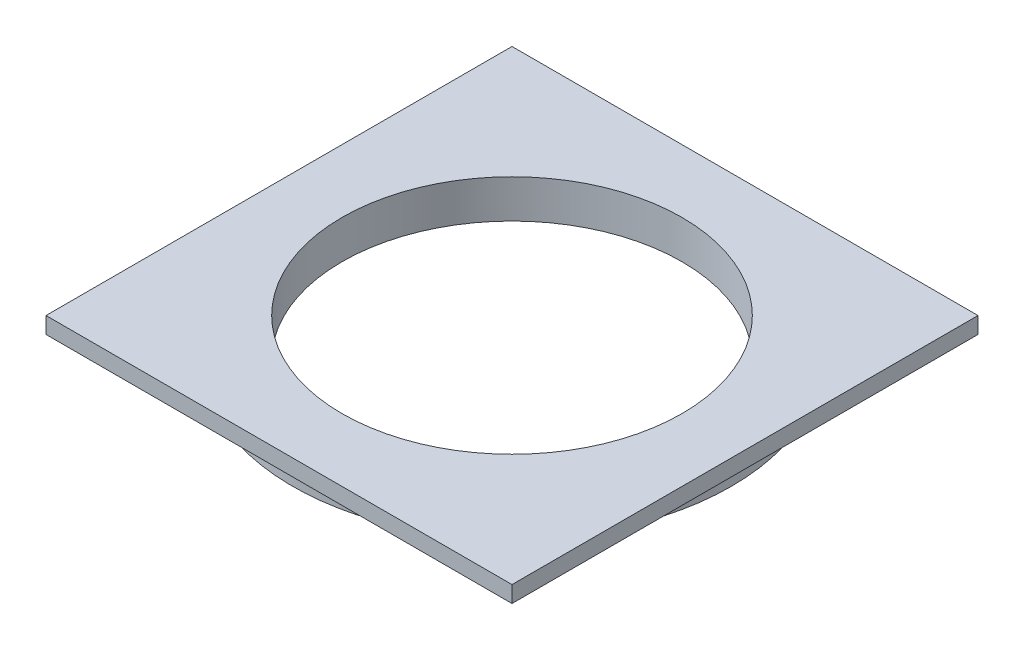
ISO-10303-21;
HEADER;
FILE_DESCRIPTION(('STEP AP214'),'2;1');
FILE_NAME('part.step','',(''),(''),'','','');
FILE_SCHEMA(('AUTOMOTIVE_DESIGN { 1 0 10303 214 1 1 1 1 }'));
ENDSEC;
DATA;
#1=APPLICATION_CONTEXT('core data for automotive mechanical design processes');
#2=APPLICATION_PROTOCOL_DEFINITION('international standard','automotive_design',2000,#1);
#3=PRODUCT_CONTEXT('',#1,'mechanical');
#4=PRODUCT('Part','Part','',(#3));
#5=PRODUCT_RELATED_PRODUCT_CATEGORY('part','',(#4));
#6=PRODUCT_DEFINITION_FORMATION('','',#4);
#7=PRODUCT_DEFINITION_CONTEXT('part definition',#1,'design');
#8=PRODUCT_DEFINITION('design','',#6,#7);
#9=PRODUCT_DEFINITION_SHAPE('','',#8);
#10=(LENGTH_UNIT() NAMED_UNIT(*) SI_UNIT(.MILLI.,.METRE.));
#11=(NAMED_UNIT(*) PLANE_ANGLE_UNIT() SI_UNIT($,.RADIAN.));
#12=(NAMED_UNIT(*) SI_UNIT($,.STERADIAN.) SOLID_ANGLE_UNIT());
#13=UNCERTAINTY_MEASURE_WITH_UNIT(LENGTH_MEASURE(1.E-05),#10,'distance_accuracy_value','');
#14=(GEOMETRIC_REPRESENTATION_CONTEXT(3) GLOBAL_UNCERTAINTY_ASSIGNED_CONTEXT((#13)) GLOBAL_UNIT_ASSIGNED_CONTEXT((#10,
#11,#12)) REPRESENTATION_CONTEXT('',''));
#15=CARTESIAN_POINT('',(0.,0.,0.));
#16=DIRECTION('',(0.,0.,1.));
#17=DIRECTION('',(1.,0.,0.));
#18=AXIS2_PLACEMENT_3D('',#15,#16,#17);
#19=CARTESIAN_POINT('',(-42.5,-3.,42.5));
#20=DIRECTION('',(1.,0.,0.));
#21=DIRECTION('',(0.,0.,-1.));
#22=AXIS2_PLACEMENT_3D('',#19,#20,#21);
#23=PLANE('',#22);
#24=DIRECTION('',(0.,0.,-1.));
#25=VECTOR('',#24,1.);
#26=CARTESIAN_POINT('',(-42.5,0.,42.5));
#27=LINE('',#26,#25);
#28=CARTESIAN_POINT('',(-42.5,0.,42.5));
#29=VERTEX_POINT('',#28);
#30=CARTESIAN_POINT('',(-42.5,0.,-42.5));
#31=VERTEX_POINT('',#30);
#32=EDGE_CURVE('E87',#29,#31,#27,.T.);
#33=ORIENTED_EDGE('',*,*,#32,.T.);
#34=DIRECTION('',(0.,1.,0.));
#35=VECTOR('',#34,1.);
#36=CARTESIAN_POINT('',(-42.5,-3.,-42.5));
#37=LINE('',#36,#35);
#38=CARTESIAN_POINT('',(-42.5,-3.,-42.5));
#39=VERTEX_POINT('',#38);
#40=EDGE_CURVE('E26',#39,#31,#37,.T.);
#41=ORIENTED_EDGE('',*,*,#40,.F.);
#42=DIRECTION('',(0.,0.,-1.));
#43=VECTOR('',#42,1.);
#44=CARTESIAN_POINT('',(-42.5,-3.,42.5));
#45=LINE('',#44,#43);
#46=CARTESIAN_POINT('',(-42.5,-3.,42.5));
#47=VERTEX_POINT('',#46);
#48=EDGE_CURVE('E70',#47,#39,#45,.T.);
#49=ORIENTED_EDGE('',*,*,#48,.F.);
#50=DIRECTION('',(0.,1.,0.));
#51=VECTOR('',#50,1.);
#52=CARTESIAN_POINT('',(-42.5,-3.,42.5));
#53=LINE('',#52,#51);
#54=EDGE_CURVE('E80',#47,#29,#53,.T.);
#55=ORIENTED_EDGE('',*,*,#54,.T.);
#56=EDGE_LOOP('',(#33,#41,#49,#55));
#57=FACE_BOUND('',#56,.T.);
#58=ADVANCED_FACE('F17',(#57),#23,.F.);
#59=CARTESIAN_POINT('',(-42.5,-3.,-42.5));
#60=DIRECTION('',(0.,0.,1.));
#61=DIRECTION('',(1.,0.,0.));
#62=AXIS2_PLACEMENT_3D('',#59,#60,#61);
#63=PLANE('',#62);
#64=DIRECTION('',(1.,0.,0.));
#65=VECTOR('',#64,1.);
#66=CARTESIAN_POINT('',(-42.5,0.,-42.5));
#67=LINE('',#66,#65);
#68=CARTESIAN_POINT('',(42.5,0.,-42.5));
#69=VERTEX_POINT('',#68);
#70=EDGE_CURVE('E75',#31,#69,#67,.T.);
#71=ORIENTED_EDGE('',*,*,#70,.T.);
#72=DIRECTION('',(0.,1.,0.));
#73=VECTOR('',#72,1.);
#74=CARTESIAN_POINT('',(42.5,-3.,-42.5));
#75=LINE('',#74,#73);
#76=CARTESIAN_POINT('',(42.5,-3.,-42.5));
#77=VERTEX_POINT('',#76);
#78=EDGE_CURVE('E73',#77,#69,#75,.T.);
#79=ORIENTED_EDGE('',*,*,#78,.F.);
#80=DIRECTION('',(1.,0.,0.));
#81=VECTOR('',#80,1.);
#82=CARTESIAN_POINT('',(-42.5,-3.,-42.5));
#83=LINE('',#82,#81);
#84=EDGE_CURVE('E65',#39,#77,#83,.T.);
#85=ORIENTED_EDGE('',*,*,#84,.F.);
#86=ORIENTED_EDGE('',*,*,#40,.T.);
#87=EDGE_LOOP('',(#71,#79,#85,#86));
#88=FACE_BOUND('',#87,.T.);
#89=ADVANCED_FACE('F74',(#88),#63,.F.);
#90=CARTESIAN_POINT('',(42.5,-3.,-42.5));
#91=DIRECTION('',(-1.,0.,0.));
#92=DIRECTION('',(0.,0.,1.));
#93=AXIS2_PLACEMENT_3D('',#90,#91,#92);
#94=PLANE('',#93);
#95=DIRECTION('',(0.,0.,1.));
#96=VECTOR('',#95,1.);
#97=CARTESIAN_POINT('',(42.5,0.,-42.5));
#98=LINE('',#97,#96);
#99=CARTESIAN_POINT('',(42.5,0.,42.5));
#100=VERTEX_POINT('',#99);
#101=EDGE_CURVE('E51',#69,#100,#98,.T.);
#102=ORIENTED_EDGE('',*,*,#101,.T.);
#103=DIRECTION('',(0.,1.,0.));
#104=VECTOR('',#103,1.);
#105=CARTESIAN_POINT('',(42.5,-3.,42.5));
#106=LINE('',#105,#104);
#107=CARTESIAN_POINT('',(42.5,-3.,42.5));
#108=VERTEX_POINT('',#107);
#109=EDGE_CURVE('E76',#108,#100,#106,.T.);
#110=ORIENTED_EDGE('',*,*,#109,.F.);
#111=DIRECTION('',(0.,0.,1.));
#112=VECTOR('',#111,1.);
#113=CARTESIAN_POINT('',(42.5,-3.,-42.5));
#114=LINE('',#113,#112);
#115=EDGE_CURVE('E68',#77,#108,#114,.T.);
#116=ORIENTED_EDGE('',*,*,#115,.F.);
#117=ORIENTED_EDGE('',*,*,#78,.T.);
#118=EDGE_LOOP('',(#102,#110,#116,#117));
#119=FACE_BOUND('',#118,.T.);
#120=ADVANCED_FACE('F78',(#119),#94,.F.);
#121=CARTESIAN_POINT('',(42.5,-3.,42.5));
#122=DIRECTION('',(0.,0.,-1.));
#123=DIRECTION('',(-1.,0.,0.));
#124=AXIS2_PLACEMENT_3D('',#121,#122,#123);
#125=PLANE('',#124);
#126=DIRECTION('',(-1.,0.,0.));
#127=VECTOR('',#126,1.);
#128=CARTESIAN_POINT('',(42.5,0.,42.5));
#129=LINE('',#128,#127);
#130=EDGE_CURVE('E57',#100,#29,#129,.T.);
#131=ORIENTED_EDGE('',*,*,#130,.T.);
#132=ORIENTED_EDGE('',*,*,#54,.F.);
#133=DIRECTION('',(-1.,0.,0.));
#134=VECTOR('',#133,1.);
#135=CARTESIAN_POINT('',(42.5,-3.,42.5));
#136=LINE('',#135,#134);
#137=EDGE_CURVE('E34',#108,#47,#136,.T.);
#138=ORIENTED_EDGE('',*,*,#137,.F.);
#139=ORIENTED_EDGE('',*,*,#109,.T.);
#140=EDGE_LOOP('',(#131,#132,#138,#139));
#141=FACE_BOUND('',#140,.T.);
#142=ADVANCED_FACE('F113',(#141),#125,.F.);
#143=CARTESIAN_POINT('',(0.,-3.,0.));
#144=DIRECTION('',(0.,-1.,0.));
#145=DIRECTION('',(0.,0.,-1.));
#146=AXIS2_PLACEMENT_3D('',#143,#144,#145);
#147=PLANE('',#146);
#148=CARTESIAN_POINT('',(0.,-3.,0.));
#149=DIRECTION('',(0.,-1.,0.));
#150=DIRECTION('',(0.,0.,-1.));
#151=AXIS2_PLACEMENT_3D('',#148,#149,#150);
#152=CIRCLE('',#151,40.);
#153=CARTESIAN_POINT('',(0.,-3.,-40.));
#154=VERTEX_POINT('',#153);
#155=EDGE_CURVE('E11',#154,#154,#152,.T.);
#156=ORIENTED_EDGE('',*,*,#155,.F.);
#157=EDGE_LOOP('',(#156));
#158=FACE_BOUND('',#157,.T.);
#159=ORIENTED_EDGE('',*,*,#48,.T.);
#160=ORIENTED_EDGE('',*,*,#84,.T.);
#161=ORIENTED_EDGE('',*,*,#115,.T.);
#162=ORIENTED_EDGE('',*,*,#137,.T.);
#163=EDGE_LOOP('',(#159,#160,#161,#162));
#164=FACE_BOUND('',#163,.T.);
#165=ADVANCED_FACE('F66',(#158,#164),#147,.T.);
#166=CARTESIAN_POINT('',(0.,0.,0.));
#167=DIRECTION('',(0.,-1.,0.));
#168=DIRECTION('',(0.,0.,-1.));
#169=AXIS2_PLACEMENT_3D('',#166,#167,#168);
#170=PLANE('',#169);
#171=CARTESIAN_POINT('',(0.,0.,0.));
#172=DIRECTION('',(0.,-1.,0.));
#173=DIRECTION('',(0.,0.,-1.));
#174=AXIS2_PLACEMENT_3D('',#171,#172,#173);
#175=CIRCLE('',#174,31.);
#176=CARTESIAN_POINT('',(0.,0.,-31.));
#177=VERTEX_POINT('',#176);
#178=EDGE_CURVE('E261',#177,#177,#175,.F.);
#179=ORIENTED_EDGE('',*,*,#178,.F.);
#180=EDGE_LOOP('',(#179));
#181=FACE_BOUND('',#180,.T.);
#182=ORIENTED_EDGE('',*,*,#32,.F.);
#183=ORIENTED_EDGE('',*,*,#130,.F.);
#184=ORIENTED_EDGE('',*,*,#101,.F.);
#185=ORIENTED_EDGE('',*,*,#70,.F.);
#186=EDGE_LOOP('',(#182,#183,#184,#185));
#187=FACE_BOUND('',#186,.T.);
#188=ADVANCED_FACE('F100',(#181,#187),#170,.F.);
#189=CARTESIAN_POINT('',(0.,-7.,0.));
#190=DIRECTION('',(0.,1.,0.));
#191=DIRECTION('',(0.,0.,1.));
#192=AXIS2_PLACEMENT_3D('',#189,#190,#191);
#193=CYLINDRICAL_SURFACE('',#192,40.);
#194=CARTESIAN_POINT('',(0.,-7.,0.));
#195=DIRECTION('',(0.,1.,0.));
#196=DIRECTION('',(1.,0.,0.));
#197=AXIS2_PLACEMENT_3D('',#194,#195,#196);
#198=CIRCLE('',#197,40.);
#199=CARTESIAN_POINT('',(40.,-7.,0.));
#200=VERTEX_POINT('',#199);
#201=EDGE_CURVE('E95',#200,#200,#198,.T.);
#202=ORIENTED_EDGE('',*,*,#201,.T.);
#203=EDGE_LOOP('',(#202));
#204=FACE_BOUND('',#203,.T.);
#205=ORIENTED_EDGE('',*,*,#155,.T.);
#206=EDGE_LOOP('',(#205));
#207=FACE_BOUND('',#206,.T.);
#208=ADVANCED_FACE('F102',(#204,#207),#193,.T.);
#209=CARTESIAN_POINT('',(0.,-7.,0.));
#210=DIRECTION('',(0.,1.,0.));
#211=DIRECTION('',(0.,0.,1.));
#212=AXIS2_PLACEMENT_3D('',#209,#210,#211);
#213=PLANE('',#212);
#214=CARTESIAN_POINT('',(0.,-7.00000000000001,0.));
#215=DIRECTION('',(0.,1.,0.));
#216=DIRECTION('',(0.,0.,1.));
#217=AXIS2_PLACEMENT_3D('',#214,#215,#216);
#218=CIRCLE('',#217,31.);
#219=CARTESIAN_POINT('',(0.,-7.00000000000001,31.));
#220=VERTEX_POINT('',#219);
#221=EDGE_CURVE('E259',#220,#220,#218,.T.);
#222=ORIENTED_EDGE('',*,*,#221,.T.);
#223=EDGE_LOOP('',(#222));
#224=FACE_BOUND('',#223,.T.);
#225=ORIENTED_EDGE('',*,*,#201,.F.);
#226=EDGE_LOOP('',(#225));
#227=FACE_BOUND('',#226,.T.);
#228=ADVANCED_FACE('F110',(#224,#227),#213,.F.);
#229=CARTESIAN_POINT('',(0.,-135.577229505932,0.));
#230=DIRECTION('',(0.,1.,0.));
#231=DIRECTION('',(0.,0.,1.));
#232=AXIS2_PLACEMENT_3D('',#229,#230,#231);
#233=CYLINDRICAL_SURFACE('',#232,31.);
#234=ORIENTED_EDGE('',*,*,#221,.F.);
#235=EDGE_LOOP('',(#234));
#236=FACE_BOUND('',#235,.T.);
#237=ORIENTED_EDGE('',*,*,#178,.T.);
#238=EDGE_LOOP('',(#237));
#239=FACE_BOUND('',#238,.T.);
#240=ADVANCED_FACE('F162',(#236,#239),#233,.F.);
#241=CLOSED_SHELL('',(#58,#89,#120,#142,#165,#188,#208,#228,#240));
#242=MANIFOLD_SOLID_BREP('B1',#241);
#243=ADVANCED_BREP_SHAPE_REPRESENTATION('',(#18,#242),#14);
#244=SHAPE_DEFINITION_REPRESENTATION(#9,#243);
ENDSEC;
END-ISO-10303-21;
